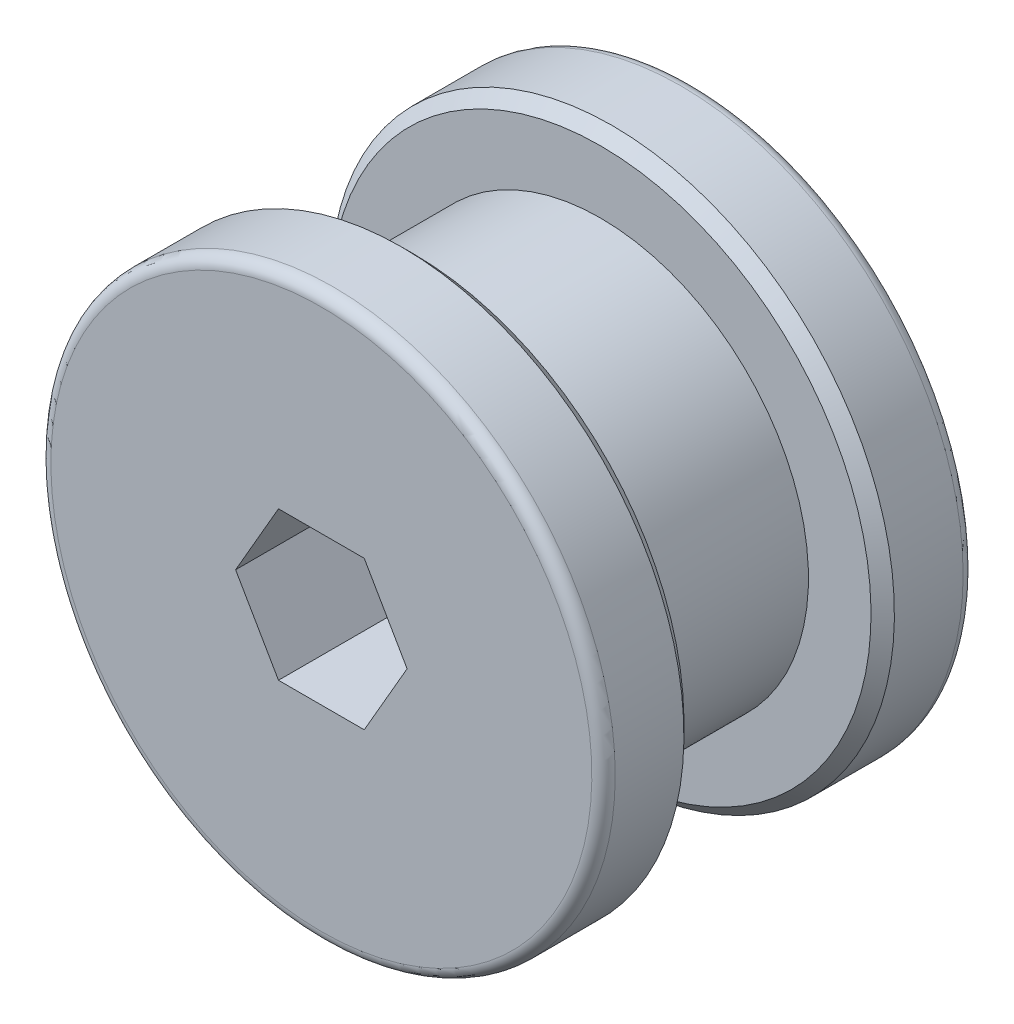
ISO-10303-21;
HEADER;
FILE_DESCRIPTION(('STEP AP214'),'2;1');
FILE_NAME('part.step','',(''),(''),'','','');
FILE_SCHEMA(('AUTOMOTIVE_DESIGN { 1 0 10303 214 1 1 1 1 }'));
ENDSEC;
DATA;
#1=APPLICATION_CONTEXT('core data for automotive mechanical design processes');
#2=APPLICATION_PROTOCOL_DEFINITION('international standard','automotive_design',2000,#1);
#3=PRODUCT_CONTEXT('',#1,'mechanical');
#4=PRODUCT('Part','Part','',(#3));
#5=PRODUCT_RELATED_PRODUCT_CATEGORY('part','',(#4));
#6=PRODUCT_DEFINITION_FORMATION('','',#4);
#7=PRODUCT_DEFINITION_CONTEXT('part definition',#1,'design');
#8=PRODUCT_DEFINITION('design','',#6,#7);
#9=PRODUCT_DEFINITION_SHAPE('','',#8);
#10=(LENGTH_UNIT() NAMED_UNIT(*) SI_UNIT(.MILLI.,.METRE.));
#11=(NAMED_UNIT(*) PLANE_ANGLE_UNIT() SI_UNIT($,.RADIAN.));
#12=(NAMED_UNIT(*) SI_UNIT($,.STERADIAN.) SOLID_ANGLE_UNIT());
#13=UNCERTAINTY_MEASURE_WITH_UNIT(LENGTH_MEASURE(1.E-05),#10,'distance_accuracy_value','');
#14=(GEOMETRIC_REPRESENTATION_CONTEXT(3) GLOBAL_UNCERTAINTY_ASSIGNED_CONTEXT((#13)) GLOBAL_UNIT_ASSIGNED_CONTEXT((#10,
#11,#12)) REPRESENTATION_CONTEXT('',''));
#15=CARTESIAN_POINT('',(0.,0.,0.));
#16=DIRECTION('',(0.,0.,1.));
#17=DIRECTION('',(1.,0.,0.));
#18=AXIS2_PLACEMENT_3D('',#15,#16,#17);
#19=CARTESIAN_POINT('',(0.,0.,-15.875));
#20=DIRECTION('',(0.,0.,1.));
#21=DIRECTION('',(0.,-1.,0.));
#22=AXIS2_PLACEMENT_3D('',#19,#20,#21);
#23=PLANE('',#22);
#24=DIRECTION('',(1.,0.,0.));
#25=VECTOR('',#24,1.);
#26=CARTESIAN_POINT('',(-3.66617420935412,-6.35,-15.875));
#27=LINE('',#26,#25);
#28=CARTESIAN_POINT('',(-3.66617420935412,-6.35,-15.875));
#29=VERTEX_POINT('',#28);
#30=CARTESIAN_POINT('',(3.66617420935412,-6.35,-15.875));
#31=VERTEX_POINT('',#30);
#32=EDGE_CURVE('E106',#29,#31,#27,.T.);
#33=ORIENTED_EDGE('',*,*,#32,.T.);
#34=DIRECTION('',(0.5,0.866025403784439,0.));
#35=VECTOR('',#34,1.);
#36=CARTESIAN_POINT('',(3.66617420935412,-6.35,-15.875));
#37=LINE('',#36,#35);
#38=CARTESIAN_POINT('',(7.33234841870825,0.,-15.875));
#39=VERTEX_POINT('',#38);
#40=EDGE_CURVE('E100',#31,#39,#37,.T.);
#41=ORIENTED_EDGE('',*,*,#40,.T.);
#42=DIRECTION('',(-0.5,0.866025403784438,0.));
#43=VECTOR('',#42,1.);
#44=CARTESIAN_POINT('',(7.33234841870825,0.,-15.875));
#45=LINE('',#44,#43);
#46=CARTESIAN_POINT('',(3.66617420935412,6.35,-15.875));
#47=VERTEX_POINT('',#46);
#48=EDGE_CURVE('E109',#39,#47,#45,.T.);
#49=ORIENTED_EDGE('',*,*,#48,.T.);
#50=DIRECTION('',(-1.,0.,0.));
#51=VECTOR('',#50,1.);
#52=CARTESIAN_POINT('',(3.66617420935412,6.35,-15.875));
#53=LINE('',#52,#51);
#54=CARTESIAN_POINT('',(-3.66617420935412,6.35,-15.875));
#55=VERTEX_POINT('',#54);
#56=EDGE_CURVE('E60',#47,#55,#53,.T.);
#57=ORIENTED_EDGE('',*,*,#56,.T.);
#58=DIRECTION('',(-0.5,-0.866025403784438,0.));
#59=VECTOR('',#58,1.);
#60=CARTESIAN_POINT('',(-3.66617420935412,6.35,-15.875));
#61=LINE('',#60,#59);
#62=CARTESIAN_POINT('',(-7.33234841870825,0.,-15.875));
#63=VERTEX_POINT('',#62);
#64=EDGE_CURVE('E122',#55,#63,#61,.T.);
#65=ORIENTED_EDGE('',*,*,#64,.T.);
#66=DIRECTION('',(0.5,-0.866025403784438,0.));
#67=VECTOR('',#66,1.);
#68=CARTESIAN_POINT('',(-7.33234841870825,0.,-15.875));
#69=LINE('',#68,#67);
#70=EDGE_CURVE('E126',#63,#29,#69,.T.);
#71=ORIENTED_EDGE('',*,*,#70,.T.);
#72=EDGE_LOOP('',(#33,#41,#49,#57,#65,#71));
#73=FACE_BOUND('',#72,.T.);
#74=CARTESIAN_POINT('',(0.,0.,-15.875));
#75=DIRECTION('',(0.,0.,1.));
#76=DIRECTION('',(0.,-1.,0.));
#77=AXIS2_PLACEMENT_3D('',#74,#75,#76);
#78=CIRCLE('',#77,23.13);
#79=CARTESIAN_POINT('',(0.,-23.13,-15.875));
#80=VERTEX_POINT('',#79);
#81=EDGE_CURVE('E156',#80,#80,#78,.F.);
#82=ORIENTED_EDGE('',*,*,#81,.T.);
#83=EDGE_LOOP('',(#82));
#84=FACE_BOUND('',#83,.T.);
#85=ADVANCED_FACE('F43',(#73,#84),#23,.F.);
#86=CARTESIAN_POINT('',(0.,0.,-15.875));
#87=DIRECTION('',(0.,0.,-1.));
#88=DIRECTION('',(0.,1.,0.));
#89=AXIS2_PLACEMENT_3D('',#86,#87,#88);
#90=CYLINDRICAL_SURFACE('',#89,24.13);
#91=CARTESIAN_POINT('',(0.,0.,-9.00000000000002));
#92=DIRECTION('',(0.,0.,-1.));
#93=DIRECTION('',(0.,1.,0.));
#94=AXIS2_PLACEMENT_3D('',#91,#92,#93);
#95=CIRCLE('',#94,24.13);
#96=CARTESIAN_POINT('',(0.,24.13,-9.00000000000002));
#97=VERTEX_POINT('',#96);
#98=EDGE_CURVE('E180',#97,#97,#95,.T.);
#99=ORIENTED_EDGE('',*,*,#98,.T.);
#100=EDGE_LOOP('',(#99));
#101=FACE_BOUND('',#100,.T.);
#102=CARTESIAN_POINT('',(0.,0.,-14.875));
#103=DIRECTION('',(0.,0.,1.));
#104=DIRECTION('',(0.,-1.,0.));
#105=AXIS2_PLACEMENT_3D('',#102,#103,#104);
#106=CIRCLE('',#105,24.13);
#107=CARTESIAN_POINT('',(0.,-24.13,-14.875));
#108=VERTEX_POINT('',#107);
#109=EDGE_CURVE('E160',#108,#108,#106,.T.);
#110=ORIENTED_EDGE('',*,*,#109,.T.);
#111=EDGE_LOOP('',(#110));
#112=FACE_BOUND('',#111,.T.);
#113=ADVANCED_FACE('F225',(#101,#112),#90,.T.);
#114=CARTESIAN_POINT('',(0.,0.,-8.));
#115=DIRECTION('',(0.,0.,-1.));
#116=DIRECTION('',(0.,1.,0.));
#117=AXIS2_PLACEMENT_3D('',#114,#115,#116);
#118=PLANE('',#117);
#119=CARTESIAN_POINT('',(0.,0.,-8.));
#120=DIRECTION('',(0.,0.,-1.));
#121=DIRECTION('',(0.,1.,0.));
#122=AXIS2_PLACEMENT_3D('',#119,#120,#121);
#123=CIRCLE('',#122,23.13);
#124=CARTESIAN_POINT('',(0.,23.13,-8.));
#125=VERTEX_POINT('',#124);
#126=EDGE_CURVE('E184',#125,#125,#123,.F.);
#127=ORIENTED_EDGE('',*,*,#126,.T.);
#128=EDGE_LOOP('',(#127));
#129=FACE_BOUND('',#128,.T.);
#130=CARTESIAN_POINT('',(0.,0.,-8.));
#131=DIRECTION('',(0.,0.,-1.));
#132=DIRECTION('',(0.,1.,0.));
#133=AXIS2_PLACEMENT_3D('',#130,#131,#132);
#134=CIRCLE('',#133,17.78);
#135=CARTESIAN_POINT('',(0.,17.78,-8.));
#136=VERTEX_POINT('',#135);
#137=EDGE_CURVE('E152',#136,#136,#134,.T.);
#138=ORIENTED_EDGE('',*,*,#137,.T.);
#139=EDGE_LOOP('',(#138));
#140=FACE_BOUND('',#139,.T.);
#141=ADVANCED_FACE('F230',(#129,#140),#118,.F.);
#142=CARTESIAN_POINT('',(0.,0.,-15.875));
#143=DIRECTION('',(0.,0.,-1.));
#144=DIRECTION('',(0.,1.,0.));
#145=AXIS2_PLACEMENT_3D('',#142,#143,#144);
#146=CYLINDRICAL_SURFACE('',#145,17.78);
#147=CARTESIAN_POINT('',(0.,0.,7.99999999999999));
#148=DIRECTION('',(0.,0.,-1.));
#149=DIRECTION('',(0.,1.,0.));
#150=AXIS2_PLACEMENT_3D('',#147,#148,#149);
#151=CIRCLE('',#150,17.78);
#152=CARTESIAN_POINT('',(0.,17.78,7.99999999999999));
#153=VERTEX_POINT('',#152);
#154=EDGE_CURVE('E134',#153,#153,#151,.T.);
#155=ORIENTED_EDGE('',*,*,#154,.T.);
#156=EDGE_LOOP('',(#155));
#157=FACE_BOUND('',#156,.T.);
#158=ORIENTED_EDGE('',*,*,#137,.F.);
#159=EDGE_LOOP('',(#158));
#160=FACE_BOUND('',#159,.T.);
#161=ADVANCED_FACE('F260',(#157,#160),#146,.T.);
#162=CARTESIAN_POINT('',(0.,0.,8.));
#163=DIRECTION('',(0.,0.,-1.));
#164=DIRECTION('',(0.,1.,0.));
#165=AXIS2_PLACEMENT_3D('',#162,#163,#164);
#166=PLANE('',#165);
#167=CARTESIAN_POINT('',(0.,0.,8.));
#168=DIRECTION('',(0.,0.,-1.));
#169=DIRECTION('',(0.,1.,0.));
#170=AXIS2_PLACEMENT_3D('',#167,#168,#169);
#171=CIRCLE('',#170,23.13);
#172=CARTESIAN_POINT('',(0.,23.13,8.));
#173=VERTEX_POINT('',#172);
#174=EDGE_CURVE('E172',#173,#173,#171,.T.);
#175=ORIENTED_EDGE('',*,*,#174,.T.);
#176=EDGE_LOOP('',(#175));
#177=FACE_BOUND('',#176,.T.);
#178=ORIENTED_EDGE('',*,*,#154,.F.);
#179=EDGE_LOOP('',(#178));
#180=FACE_BOUND('',#179,.T.);
#181=ADVANCED_FACE('F256',(#177,#180),#166,.T.);
#182=CARTESIAN_POINT('',(0.,0.,-15.875));
#183=DIRECTION('',(0.,0.,-1.));
#184=DIRECTION('',(0.,1.,0.));
#185=AXIS2_PLACEMENT_3D('',#182,#183,#184);
#186=CYLINDRICAL_SURFACE('',#185,24.13);
#187=CARTESIAN_POINT('',(0.,0.,9.00000000000002));
#188=DIRECTION('',(0.,0.,-1.));
#189=DIRECTION('',(0.,1.,0.));
#190=AXIS2_PLACEMENT_3D('',#187,#188,#189);
#191=CIRCLE('',#190,24.13);
#192=CARTESIAN_POINT('',(0.,24.13,9.00000000000002));
#193=VERTEX_POINT('',#192);
#194=EDGE_CURVE('E176',#193,#193,#191,.F.);
#195=ORIENTED_EDGE('',*,*,#194,.T.);
#196=EDGE_LOOP('',(#195));
#197=FACE_BOUND('',#196,.T.);
#198=CARTESIAN_POINT('',(0.,0.,14.875));
#199=DIRECTION('',(0.,0.,1.));
#200=DIRECTION('',(0.,-1.,0.));
#201=AXIS2_PLACEMENT_3D('',#198,#199,#200);
#202=CIRCLE('',#201,24.13);
#203=CARTESIAN_POINT('',(0.,-24.13,14.875));
#204=VERTEX_POINT('',#203);
#205=EDGE_CURVE('E164',#204,#204,#202,.F.);
#206=ORIENTED_EDGE('',*,*,#205,.T.);
#207=EDGE_LOOP('',(#206));
#208=FACE_BOUND('',#207,.T.);
#209=ADVANCED_FACE('F259',(#197,#208),#186,.T.);
#210=CARTESIAN_POINT('',(0.,0.,15.875));
#211=DIRECTION('',(0.,0.,1.));
#212=DIRECTION('',(0.,-1.,0.));
#213=AXIS2_PLACEMENT_3D('',#210,#211,#212);
#214=PLANE('',#213);
#215=DIRECTION('',(0.5,0.866025403784439,0.));
#216=VECTOR('',#215,1.);
#217=CARTESIAN_POINT('',(5.49926131403118,-3.175,15.875));
#218=LINE('',#217,#216);
#219=CARTESIAN_POINT('',(3.66617420935412,-6.35,15.875));
#220=VERTEX_POINT('',#219);
#221=CARTESIAN_POINT('',(7.33234841870825,0.,15.875));
#222=VERTEX_POINT('',#221);
#223=EDGE_CURVE('E11',#220,#222,#218,.T.);
#224=ORIENTED_EDGE('',*,*,#223,.F.);
#225=DIRECTION('',(1.,0.,0.));
#226=VECTOR('',#225,1.);
#227=CARTESIAN_POINT('',(0.,-6.35,15.875));
#228=LINE('',#227,#226);
#229=CARTESIAN_POINT('',(-3.66617420935412,-6.35,15.875));
#230=VERTEX_POINT('',#229);
#231=EDGE_CURVE('E53',#230,#220,#228,.T.);
#232=ORIENTED_EDGE('',*,*,#231,.F.);
#233=DIRECTION('',(0.5,-0.866025403784439,0.));
#234=VECTOR('',#233,1.);
#235=CARTESIAN_POINT('',(-5.49926131403118,-3.175,15.875));
#236=LINE('',#235,#234);
#237=CARTESIAN_POINT('',(-7.33234841870825,0.,15.875));
#238=VERTEX_POINT('',#237);
#239=EDGE_CURVE('E197',#238,#230,#236,.T.);
#240=ORIENTED_EDGE('',*,*,#239,.F.);
#241=DIRECTION('',(-0.5,-0.866025403784439,0.));
#242=VECTOR('',#241,1.);
#243=CARTESIAN_POINT('',(-5.49926131403119,3.175,15.875));
#244=LINE('',#243,#242);
#245=CARTESIAN_POINT('',(-3.66617420935412,6.35,15.875));
#246=VERTEX_POINT('',#245);
#247=EDGE_CURVE('E194',#246,#238,#244,.T.);
#248=ORIENTED_EDGE('',*,*,#247,.F.);
#249=DIRECTION('',(-1.,0.,0.));
#250=VECTOR('',#249,1.);
#251=CARTESIAN_POINT('',(0.,6.35,15.875));
#252=LINE('',#251,#250);
#253=CARTESIAN_POINT('',(3.66617420935412,6.35,15.875));
#254=VERTEX_POINT('',#253);
#255=EDGE_CURVE('E191',#254,#246,#252,.T.);
#256=ORIENTED_EDGE('',*,*,#255,.F.);
#257=DIRECTION('',(-0.5,0.866025403784439,0.));
#258=VECTOR('',#257,1.);
#259=CARTESIAN_POINT('',(5.49926131403118,3.175,15.875));
#260=LINE('',#259,#258);
#261=EDGE_CURVE('E188',#222,#254,#260,.T.);
#262=ORIENTED_EDGE('',*,*,#261,.F.);
#263=EDGE_LOOP('',(#224,#232,#240,#248,#256,#262));
#264=FACE_BOUND('',#263,.T.);
#265=CARTESIAN_POINT('',(0.,0.,15.875));
#266=DIRECTION('',(0.,0.,1.));
#267=DIRECTION('',(0.,-1.,0.));
#268=AXIS2_PLACEMENT_3D('',#265,#266,#267);
#269=CIRCLE('',#268,23.13);
#270=CARTESIAN_POINT('',(0.,-23.13,15.875));
#271=VERTEX_POINT('',#270);
#272=EDGE_CURVE('E168',#271,#271,#269,.T.);
#273=ORIENTED_EDGE('',*,*,#272,.T.);
#274=EDGE_LOOP('',(#273));
#275=FACE_BOUND('',#274,.T.);
#276=ADVANCED_FACE('F205',(#264,#275),#214,.T.);
#277=CARTESIAN_POINT('',(0.,0.,-14.875));
#278=DIRECTION('',(0.,0.,1.));
#279=DIRECTION('',(0.,-1.,0.));
#280=AXIS2_PLACEMENT_3D('',#277,#278,#279);
#281=TOROIDAL_SURFACE('',#280,23.13,1.);
#282=ORIENTED_EDGE('',*,*,#109,.F.);
#283=EDGE_LOOP('',(#282));
#284=FACE_BOUND('',#283,.T.);
#285=ORIENTED_EDGE('',*,*,#81,.F.);
#286=EDGE_LOOP('',(#285));
#287=FACE_BOUND('',#286,.T.);
#288=ADVANCED_FACE('F235',(#284,#287),#281,.T.);
#289=CARTESIAN_POINT('',(0.,0.,14.875));
#290=DIRECTION('',(0.,0.,1.));
#291=DIRECTION('',(0.,-1.,0.));
#292=AXIS2_PLACEMENT_3D('',#289,#290,#291);
#293=TOROIDAL_SURFACE('',#292,23.13,1.);
#294=ORIENTED_EDGE('',*,*,#272,.F.);
#295=EDGE_LOOP('',(#294));
#296=FACE_BOUND('',#295,.T.);
#297=ORIENTED_EDGE('',*,*,#205,.F.);
#298=EDGE_LOOP('',(#297));
#299=FACE_BOUND('',#298,.T.);
#300=ADVANCED_FACE('F238',(#296,#299),#293,.T.);
#301=CARTESIAN_POINT('',(0.,0.,8.));
#302=DIRECTION('',(0.,0.,1.));
#303=DIRECTION('',(0.,-1.,0.));
#304=AXIS2_PLACEMENT_3D('',#301,#302,#303);
#305=CONICAL_SURFACE('',#304,23.13,0.785398163397445);
#306=ORIENTED_EDGE('',*,*,#194,.F.);
#307=EDGE_LOOP('',(#306));
#308=FACE_BOUND('',#307,.T.);
#309=ORIENTED_EDGE('',*,*,#174,.F.);
#310=EDGE_LOOP('',(#309));
#311=FACE_BOUND('',#310,.T.);
#312=ADVANCED_FACE('F241',(#308,#311),#305,.T.);
#313=CARTESIAN_POINT('',(0.,0.,-9.00000000000003));
#314=DIRECTION('',(0.,0.,-1.));
#315=DIRECTION('',(0.,1.,0.));
#316=AXIS2_PLACEMENT_3D('',#313,#314,#315);
#317=CONICAL_SURFACE('',#316,24.13,0.78539816339745);
#318=ORIENTED_EDGE('',*,*,#126,.F.);
#319=EDGE_LOOP('',(#318));
#320=FACE_BOUND('',#319,.T.);
#321=ORIENTED_EDGE('',*,*,#98,.F.);
#322=EDGE_LOOP('',(#321));
#323=FACE_BOUND('',#322,.T.);
#324=ADVANCED_FACE('F46',(#320,#323),#317,.T.);
#325=CARTESIAN_POINT('',(3.66617420935412,-6.35,-15.875));
#326=DIRECTION('',(0.866025403784439,-0.5,0.));
#327=DIRECTION('',(0.5,0.866025403784439,0.));
#328=AXIS2_PLACEMENT_3D('',#325,#326,#327);
#329=PLANE('',#328);
#330=ORIENTED_EDGE('',*,*,#223,.T.);
#331=DIRECTION('',(0.,0.,1.));
#332=VECTOR('',#331,1.);
#333=CARTESIAN_POINT('',(7.33234841870825,0.,-15.875));
#334=LINE('',#333,#332);
#335=EDGE_CURVE('E68',#39,#222,#334,.T.);
#336=ORIENTED_EDGE('',*,*,#335,.F.);
#337=ORIENTED_EDGE('',*,*,#40,.F.);
#338=DIRECTION('',(0.,0.,1.));
#339=VECTOR('',#338,1.);
#340=CARTESIAN_POINT('',(3.66617420935412,-6.35,-15.875));
#341=LINE('',#340,#339);
#342=EDGE_CURVE('E131',#31,#220,#341,.T.);
#343=ORIENTED_EDGE('',*,*,#342,.T.);
#344=EDGE_LOOP('',(#330,#336,#337,#343));
#345=FACE_BOUND('',#344,.T.);
#346=ADVANCED_FACE('F97',(#345),#329,.F.);
#347=CARTESIAN_POINT('',(-3.66617420935412,-6.35,-15.875));
#348=DIRECTION('',(0.,-1.,0.));
#349=DIRECTION('',(1.,0.,0.));
#350=AXIS2_PLACEMENT_3D('',#347,#348,#349);
#351=PLANE('',#350);
#352=ORIENTED_EDGE('',*,*,#231,.T.);
#353=ORIENTED_EDGE('',*,*,#342,.F.);
#354=ORIENTED_EDGE('',*,*,#32,.F.);
#355=DIRECTION('',(0.,0.,1.));
#356=VECTOR('',#355,1.);
#357=CARTESIAN_POINT('',(-3.66617420935412,-6.35,-15.875));
#358=LINE('',#357,#356);
#359=EDGE_CURVE('E135',#29,#230,#358,.T.);
#360=ORIENTED_EDGE('',*,*,#359,.T.);
#361=EDGE_LOOP('',(#352,#353,#354,#360));
#362=FACE_BOUND('',#361,.T.);
#363=ADVANCED_FACE('F202',(#362),#351,.F.);
#364=CARTESIAN_POINT('',(-7.33234841870825,0.,-15.875));
#365=DIRECTION('',(-0.866025403784438,-0.5,0.));
#366=DIRECTION('',(0.5,-0.866025403784439,0.));
#367=AXIS2_PLACEMENT_3D('',#364,#365,#366);
#368=PLANE('',#367);
#369=ORIENTED_EDGE('',*,*,#239,.T.);
#370=ORIENTED_EDGE('',*,*,#359,.F.);
#371=ORIENTED_EDGE('',*,*,#70,.F.);
#372=DIRECTION('',(0.,0.,1.));
#373=VECTOR('',#372,1.);
#374=CARTESIAN_POINT('',(-7.33234841870825,0.,-15.875));
#375=LINE('',#374,#373);
#376=EDGE_CURVE('E139',#63,#238,#375,.T.);
#377=ORIENTED_EDGE('',*,*,#376,.T.);
#378=EDGE_LOOP('',(#369,#370,#371,#377));
#379=FACE_BOUND('',#378,.T.);
#380=ADVANCED_FACE('F214',(#379),#368,.F.);
#381=CARTESIAN_POINT('',(-3.66617420935412,6.35,-15.875));
#382=DIRECTION('',(-0.866025403784439,0.5,0.));
#383=DIRECTION('',(-0.5,-0.866025403784439,0.));
#384=AXIS2_PLACEMENT_3D('',#381,#382,#383);
#385=PLANE('',#384);
#386=ORIENTED_EDGE('',*,*,#247,.T.);
#387=ORIENTED_EDGE('',*,*,#376,.F.);
#388=ORIENTED_EDGE('',*,*,#64,.F.);
#389=DIRECTION('',(0.,0.,1.));
#390=VECTOR('',#389,1.);
#391=CARTESIAN_POINT('',(-3.66617420935412,6.35,-15.875));
#392=LINE('',#391,#390);
#393=EDGE_CURVE('E143',#55,#246,#392,.T.);
#394=ORIENTED_EDGE('',*,*,#393,.T.);
#395=EDGE_LOOP('',(#386,#387,#388,#394));
#396=FACE_BOUND('',#395,.T.);
#397=ADVANCED_FACE('F212',(#396),#385,.F.);
#398=CARTESIAN_POINT('',(3.66617420935412,6.35,-15.875));
#399=DIRECTION('',(0.,1.,0.));
#400=DIRECTION('',(0.,0.,1.));
#401=AXIS2_PLACEMENT_3D('',#398,#399,#400);
#402=PLANE('',#401);
#403=ORIENTED_EDGE('',*,*,#255,.T.);
#404=ORIENTED_EDGE('',*,*,#393,.F.);
#405=ORIENTED_EDGE('',*,*,#56,.F.);
#406=DIRECTION('',(0.,0.,1.));
#407=VECTOR('',#406,1.);
#408=CARTESIAN_POINT('',(3.66617420935412,6.35,-15.875));
#409=LINE('',#408,#407);
#410=EDGE_CURVE('E105',#47,#254,#409,.T.);
#411=ORIENTED_EDGE('',*,*,#410,.T.);
#412=EDGE_LOOP('',(#403,#404,#405,#411));
#413=FACE_BOUND('',#412,.T.);
#414=ADVANCED_FACE('F209',(#413),#402,.F.);
#415=CARTESIAN_POINT('',(7.33234841870825,0.,-15.875));
#416=DIRECTION('',(0.866025403784438,0.5,0.));
#417=DIRECTION('',(-0.5,0.866025403784439,0.));
#418=AXIS2_PLACEMENT_3D('',#415,#416,#417);
#419=PLANE('',#418);
#420=ORIENTED_EDGE('',*,*,#261,.T.);
#421=ORIENTED_EDGE('',*,*,#410,.F.);
#422=ORIENTED_EDGE('',*,*,#48,.F.);
#423=ORIENTED_EDGE('',*,*,#335,.T.);
#424=EDGE_LOOP('',(#420,#421,#422,#423));
#425=FACE_BOUND('',#424,.T.);
#426=ADVANCED_FACE('F110',(#425),#419,.F.);
#427=CLOSED_SHELL('',(#85,#113,#141,#161,#181,#209,#276,#288,#300,#312,#324,#346,#363,#380,#397,
#414,#426));
#428=MANIFOLD_SOLID_BREP('B2',#427);
#429=ADVANCED_BREP_SHAPE_REPRESENTATION('',(#18,#428),#14);
#430=SHAPE_DEFINITION_REPRESENTATION(#9,#429);
ENDSEC;
END-ISO-10303-21;
